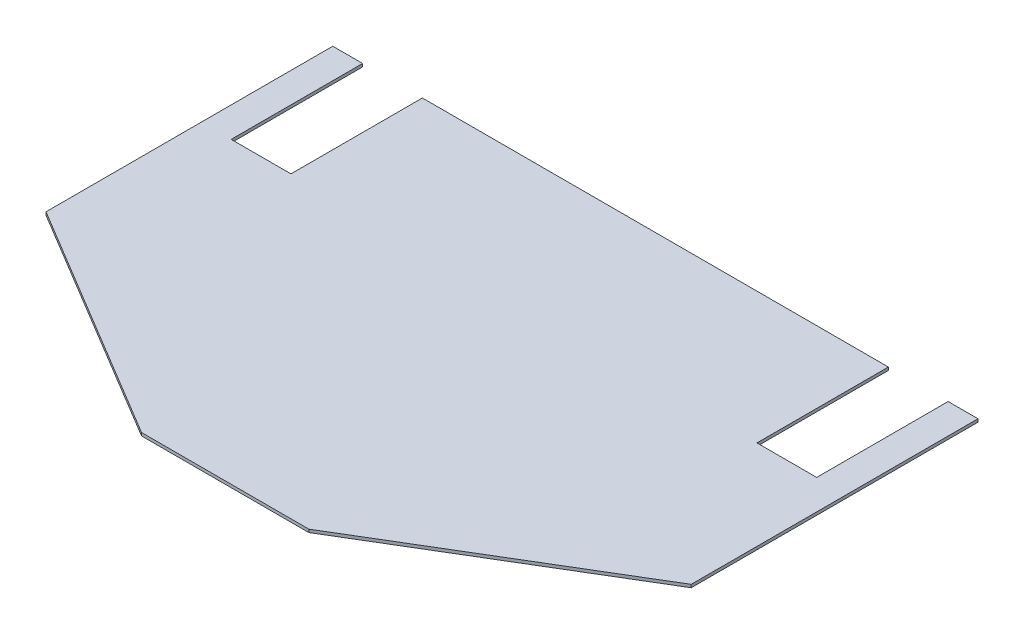
ISO-10303-21;
HEADER;
FILE_DESCRIPTION(('STEP AP214'),'2;1');
FILE_NAME('part.step','',(''),(''),'','','');
FILE_SCHEMA(('AUTOMOTIVE_DESIGN { 1 0 10303 214 1 1 1 1 }'));
ENDSEC;
DATA;
#1=APPLICATION_CONTEXT('core data for automotive mechanical design processes');
#2=APPLICATION_PROTOCOL_DEFINITION('international standard','automotive_design',2000,#1);
#3=PRODUCT_CONTEXT('',#1,'mechanical');
#4=PRODUCT('Part','Part','',(#3));
#5=PRODUCT_RELATED_PRODUCT_CATEGORY('part','',(#4));
#6=PRODUCT_DEFINITION_FORMATION('','',#4);
#7=PRODUCT_DEFINITION_CONTEXT('part definition',#1,'design');
#8=PRODUCT_DEFINITION('design','',#6,#7);
#9=PRODUCT_DEFINITION_SHAPE('','',#8);
#10=(LENGTH_UNIT() NAMED_UNIT(*) SI_UNIT(.MILLI.,.METRE.));
#11=(NAMED_UNIT(*) PLANE_ANGLE_UNIT() SI_UNIT($,.RADIAN.));
#12=(NAMED_UNIT(*) SI_UNIT($,.STERADIAN.) SOLID_ANGLE_UNIT());
#13=UNCERTAINTY_MEASURE_WITH_UNIT(LENGTH_MEASURE(1.E-05),#10,'distance_accuracy_value','');
#14=(GEOMETRIC_REPRESENTATION_CONTEXT(3) GLOBAL_UNCERTAINTY_ASSIGNED_CONTEXT((#13)) GLOBAL_UNIT_ASSIGNED_CONTEXT((#10,
#11,#12)) REPRESENTATION_CONTEXT('',''));
#15=CARTESIAN_POINT('',(0.,0.,0.));
#16=DIRECTION('',(0.,0.,1.));
#17=DIRECTION('',(1.,0.,0.));
#18=AXIS2_PLACEMENT_3D('',#15,#16,#17);
#19=CARTESIAN_POINT('',(0.,1.5875,0.));
#20=DIRECTION('',(0.,0.,-1.));
#21=DIRECTION('',(-1.,0.,0.));
#22=AXIS2_PLACEMENT_3D('',#19,#20,#21);
#23=PLANE('',#22);
#24=DIRECTION('',(1.,0.,0.));
#25=VECTOR('',#24,1.);
#26=CARTESIAN_POINT('',(0.,0.,0.));
#27=LINE('',#26,#25);
#28=CARTESIAN_POINT('',(-44.4499999999999,0.,0.));
#29=VERTEX_POINT('',#28);
#30=CARTESIAN_POINT('',(44.45,0.,0.));
#31=VERTEX_POINT('',#30);
#32=EDGE_CURVE('E170',#29,#31,#27,.T.);
#33=ORIENTED_EDGE('',*,*,#32,.T.);
#34=DIRECTION('',(0.,-1.,0.));
#35=VECTOR('',#34,1.);
#36=CARTESIAN_POINT('',(44.45,1.5875,0.));
#37=LINE('',#36,#35);
#38=CARTESIAN_POINT('',(44.45,1.5875,0.));
#39=VERTEX_POINT('',#38);
#40=EDGE_CURVE('E11',#39,#31,#37,.T.);
#41=ORIENTED_EDGE('',*,*,#40,.F.);
#42=DIRECTION('',(1.,0.,0.));
#43=VECTOR('',#42,1.);
#44=CARTESIAN_POINT('',(0.,1.5875,0.));
#45=LINE('',#44,#43);
#46=CARTESIAN_POINT('',(-44.4499999999999,1.5875,0.));
#47=VERTEX_POINT('',#46);
#48=EDGE_CURVE('E202',#47,#39,#45,.T.);
#49=ORIENTED_EDGE('',*,*,#48,.F.);
#50=DIRECTION('',(0.,-1.,0.));
#51=VECTOR('',#50,1.);
#52=CARTESIAN_POINT('',(-44.4499999999999,1.5875,0.));
#53=LINE('',#52,#51);
#54=EDGE_CURVE('E51',#47,#29,#53,.T.);
#55=ORIENTED_EDGE('',*,*,#54,.T.);
#56=EDGE_LOOP('',(#33,#41,#49,#55));
#57=FACE_BOUND('',#56,.T.);
#58=ADVANCED_FACE('F35',(#57),#23,.F.);
#59=CARTESIAN_POINT('',(11.7661764705882,1.5875,19.6102941176471));
#60=DIRECTION('',(-0.514495755427527,0.,-0.857492925712544));
#61=DIRECTION('',(-0.857492925712544,0.,0.514495755427527));
#62=AXIS2_PLACEMENT_3D('',#59,#60,#61);
#63=PLANE('',#62);
#64=DIRECTION('',(0.857492925712544,0.,-0.514495755427527));
#65=VECTOR('',#64,1.);
#66=CARTESIAN_POINT('',(11.7661764705882,0.,19.6102941176471));
#67=LINE('',#66,#65);
#68=CARTESIAN_POINT('',(171.45,0.,-76.2));
#69=VERTEX_POINT('',#68);
#70=EDGE_CURVE('E172',#31,#69,#67,.T.);
#71=ORIENTED_EDGE('',*,*,#70,.T.);
#72=DIRECTION('',(0.,-1.,0.));
#73=VECTOR('',#72,1.);
#74=CARTESIAN_POINT('',(171.45,1.5875,-76.2));
#75=LINE('',#74,#73);
#76=CARTESIAN_POINT('',(171.45,1.5875,-76.2));
#77=VERTEX_POINT('',#76);
#78=EDGE_CURVE('E43',#77,#69,#75,.T.);
#79=ORIENTED_EDGE('',*,*,#78,.F.);
#80=DIRECTION('',(0.857492925712544,0.,-0.514495755427527));
#81=VECTOR('',#80,1.);
#82=CARTESIAN_POINT('',(11.7661764705882,1.5875,19.6102941176471));
#83=LINE('',#82,#81);
#84=EDGE_CURVE('E107',#39,#77,#83,.T.);
#85=ORIENTED_EDGE('',*,*,#84,.F.);
#86=ORIENTED_EDGE('',*,*,#40,.T.);
#87=EDGE_LOOP('',(#71,#79,#85,#86));
#88=FACE_BOUND('',#87,.T.);
#89=ADVANCED_FACE('F276',(#88),#63,.F.);
#90=CARTESIAN_POINT('',(171.45,1.5875,0.));
#91=DIRECTION('',(-1.,0.,0.));
#92=DIRECTION('',(0.,0.,1.));
#93=AXIS2_PLACEMENT_3D('',#90,#91,#92);
#94=PLANE('',#93);
#95=DIRECTION('',(0.,0.,-1.));
#96=VECTOR('',#95,1.);
#97=CARTESIAN_POINT('',(171.45,0.,0.));
#98=LINE('',#97,#96);
#99=CARTESIAN_POINT('',(171.45,0.,-228.6));
#100=VERTEX_POINT('',#99);
#101=EDGE_CURVE('E174',#69,#100,#98,.T.);
#102=ORIENTED_EDGE('',*,*,#101,.T.);
#103=DIRECTION('',(0.,-1.,0.));
#104=VECTOR('',#103,1.);
#105=CARTESIAN_POINT('',(171.45,1.5875,-228.6));
#106=LINE('',#105,#104);
#107=CARTESIAN_POINT('',(171.45,1.5875,-228.6));
#108=VERTEX_POINT('',#107);
#109=EDGE_CURVE('E223',#108,#100,#106,.T.);
#110=ORIENTED_EDGE('',*,*,#109,.F.);
#111=DIRECTION('',(0.,0.,-1.));
#112=VECTOR('',#111,1.);
#113=CARTESIAN_POINT('',(171.45,1.5875,0.));
#114=LINE('',#113,#112);
#115=EDGE_CURVE('E231',#77,#108,#114,.T.);
#116=ORIENTED_EDGE('',*,*,#115,.F.);
#117=ORIENTED_EDGE('',*,*,#78,.T.);
#118=EDGE_LOOP('',(#102,#110,#116,#117));
#119=FACE_BOUND('',#118,.T.);
#120=ADVANCED_FACE('F229',(#119),#94,.F.);
#121=CARTESIAN_POINT('',(0.,1.5875,-228.6));
#122=DIRECTION('',(0.,0.,1.));
#123=DIRECTION('',(1.,0.,0.));
#124=AXIS2_PLACEMENT_3D('',#121,#122,#123);
#125=PLANE('',#124);
#126=DIRECTION('',(-1.,0.,0.));
#127=VECTOR('',#126,1.);
#128=CARTESIAN_POINT('',(0.,0.,-228.6));
#129=LINE('',#128,#127);
#130=CARTESIAN_POINT('',(155.575,0.,-228.6));
#131=VERTEX_POINT('',#130);
#132=EDGE_CURVE('E176',#100,#131,#129,.T.);
#133=ORIENTED_EDGE('',*,*,#132,.T.);
#134=DIRECTION('',(0.,-1.,0.));
#135=VECTOR('',#134,1.);
#136=CARTESIAN_POINT('',(155.575,1.5875,-228.6));
#137=LINE('',#136,#135);
#138=CARTESIAN_POINT('',(155.575,1.5875,-228.6));
#139=VERTEX_POINT('',#138);
#140=EDGE_CURVE('E220',#139,#131,#137,.T.);
#141=ORIENTED_EDGE('',*,*,#140,.F.);
#142=DIRECTION('',(-1.,0.,0.));
#143=VECTOR('',#142,1.);
#144=CARTESIAN_POINT('',(0.,1.5875,-228.6));
#145=LINE('',#144,#143);
#146=EDGE_CURVE('E248',#108,#139,#145,.T.);
#147=ORIENTED_EDGE('',*,*,#146,.F.);
#148=ORIENTED_EDGE('',*,*,#109,.T.);
#149=EDGE_LOOP('',(#133,#141,#147,#148));
#150=FACE_BOUND('',#149,.T.);
#151=ADVANCED_FACE('F239',(#150),#125,.F.);
#152=CARTESIAN_POINT('',(155.575,1.5875,0.));
#153=DIRECTION('',(1.,0.,0.));
#154=DIRECTION('',(0.,0.,-1.));
#155=AXIS2_PLACEMENT_3D('',#152,#153,#154);
#156=PLANE('',#155);
#157=DIRECTION('',(0.,0.,1.));
#158=VECTOR('',#157,1.);
#159=CARTESIAN_POINT('',(155.575,0.,0.));
#160=LINE('',#159,#158);
#161=CARTESIAN_POINT('',(155.575,0.,-158.75));
#162=VERTEX_POINT('',#161);
#163=EDGE_CURVE('E178',#131,#162,#160,.T.);
#164=ORIENTED_EDGE('',*,*,#163,.T.);
#165=DIRECTION('',(0.,-1.,0.));
#166=VECTOR('',#165,1.);
#167=CARTESIAN_POINT('',(155.575,1.5875,-158.75));
#168=LINE('',#167,#166);
#169=CARTESIAN_POINT('',(155.575,1.5875,-158.75));
#170=VERTEX_POINT('',#169);
#171=EDGE_CURVE('E217',#170,#162,#168,.T.);
#172=ORIENTED_EDGE('',*,*,#171,.F.);
#173=DIRECTION('',(0.,0.,1.));
#174=VECTOR('',#173,1.);
#175=CARTESIAN_POINT('',(155.575,1.5875,0.));
#176=LINE('',#175,#174);
#177=EDGE_CURVE('E245',#139,#170,#176,.T.);
#178=ORIENTED_EDGE('',*,*,#177,.F.);
#179=ORIENTED_EDGE('',*,*,#140,.T.);
#180=EDGE_LOOP('',(#164,#172,#178,#179));
#181=FACE_BOUND('',#180,.T.);
#182=ADVANCED_FACE('F243',(#181),#156,.F.);
#183=CARTESIAN_POINT('',(0.,1.5875,-158.75));
#184=DIRECTION('',(0.,0.,1.));
#185=DIRECTION('',(1.,0.,0.));
#186=AXIS2_PLACEMENT_3D('',#183,#184,#185);
#187=PLANE('',#186);
#188=DIRECTION('',(-1.,0.,0.));
#189=VECTOR('',#188,1.);
#190=CARTESIAN_POINT('',(0.,0.,-158.75));
#191=LINE('',#190,#189);
#192=CARTESIAN_POINT('',(123.825,0.,-158.75));
#193=VERTEX_POINT('',#192);
#194=EDGE_CURVE('E180',#162,#193,#191,.T.);
#195=ORIENTED_EDGE('',*,*,#194,.T.);
#196=DIRECTION('',(0.,-1.,0.));
#197=VECTOR('',#196,1.);
#198=CARTESIAN_POINT('',(123.825,1.5875,-158.75));
#199=LINE('',#198,#197);
#200=CARTESIAN_POINT('',(123.825,1.5875,-158.75));
#201=VERTEX_POINT('',#200);
#202=EDGE_CURVE('E215',#201,#193,#199,.T.);
#203=ORIENTED_EDGE('',*,*,#202,.F.);
#204=DIRECTION('',(-1.,0.,0.));
#205=VECTOR('',#204,1.);
#206=CARTESIAN_POINT('',(0.,1.5875,-158.75));
#207=LINE('',#206,#205);
#208=EDGE_CURVE('E247',#170,#201,#207,.T.);
#209=ORIENTED_EDGE('',*,*,#208,.F.);
#210=ORIENTED_EDGE('',*,*,#171,.T.);
#211=EDGE_LOOP('',(#195,#203,#209,#210));
#212=FACE_BOUND('',#211,.T.);
#213=ADVANCED_FACE('F292',(#212),#187,.F.);
#214=CARTESIAN_POINT('',(123.825,1.5875,0.));
#215=DIRECTION('',(1.,0.,0.));
#216=DIRECTION('',(0.,0.,-1.));
#217=AXIS2_PLACEMENT_3D('',#214,#215,#216);
#218=PLANE('',#217);
#219=DIRECTION('',(0.,0.,1.));
#220=VECTOR('',#219,1.);
#221=CARTESIAN_POINT('',(123.825,0.,0.));
#222=LINE('',#221,#220);
#223=CARTESIAN_POINT('',(123.825,0.,-228.6));
#224=VERTEX_POINT('',#223);
#225=EDGE_CURVE('E183',#224,#193,#222,.T.);
#226=ORIENTED_EDGE('',*,*,#225,.F.);
#227=DIRECTION('',(0.,-1.,0.));
#228=VECTOR('',#227,1.);
#229=CARTESIAN_POINT('',(123.825,1.5875,-228.6));
#230=LINE('',#229,#228);
#231=CARTESIAN_POINT('',(123.825,1.5875,-228.6));
#232=VERTEX_POINT('',#231);
#233=EDGE_CURVE('E213',#232,#224,#230,.T.);
#234=ORIENTED_EDGE('',*,*,#233,.F.);
#235=DIRECTION('',(0.,0.,1.));
#236=VECTOR('',#235,1.);
#237=CARTESIAN_POINT('',(123.825,1.5875,0.));
#238=LINE('',#237,#236);
#239=EDGE_CURVE('E250',#232,#201,#238,.T.);
#240=ORIENTED_EDGE('',*,*,#239,.T.);
#241=ORIENTED_EDGE('',*,*,#202,.T.);
#242=EDGE_LOOP('',(#226,#234,#240,#241));
#243=FACE_BOUND('',#242,.T.);
#244=ADVANCED_FACE('F295',(#243),#218,.T.);
#245=CARTESIAN_POINT('',(0.,1.5875,-228.6));
#246=DIRECTION('',(0.,0.,1.));
#247=DIRECTION('',(1.,0.,0.));
#248=AXIS2_PLACEMENT_3D('',#245,#246,#247);
#249=PLANE('',#248);
#250=DIRECTION('',(-1.,0.,0.));
#251=VECTOR('',#250,1.);
#252=CARTESIAN_POINT('',(0.,0.,-228.6));
#253=LINE('',#252,#251);
#254=CARTESIAN_POINT('',(-123.825,0.,-228.6));
#255=VERTEX_POINT('',#254);
#256=EDGE_CURVE('E186',#224,#255,#253,.T.);
#257=ORIENTED_EDGE('',*,*,#256,.T.);
#258=DIRECTION('',(0.,-1.,0.));
#259=VECTOR('',#258,1.);
#260=CARTESIAN_POINT('',(-123.825,1.5875,-228.6));
#261=LINE('',#260,#259);
#262=CARTESIAN_POINT('',(-123.825,1.5875,-228.6));
#263=VERTEX_POINT('',#262);
#264=EDGE_CURVE('E210',#263,#255,#261,.T.);
#265=ORIENTED_EDGE('',*,*,#264,.F.);
#266=DIRECTION('',(-1.,0.,0.));
#267=VECTOR('',#266,1.);
#268=CARTESIAN_POINT('',(0.,1.5875,-228.6));
#269=LINE('',#268,#267);
#270=EDGE_CURVE('E153',#232,#263,#269,.T.);
#271=ORIENTED_EDGE('',*,*,#270,.F.);
#272=ORIENTED_EDGE('',*,*,#233,.T.);
#273=EDGE_LOOP('',(#257,#265,#271,#272));
#274=FACE_BOUND('',#273,.T.);
#275=ADVANCED_FACE('F299',(#274),#249,.F.);
#276=CARTESIAN_POINT('',(-123.825,1.5875,0.));
#277=DIRECTION('',(1.,0.,0.));
#278=DIRECTION('',(0.,0.,-1.));
#279=AXIS2_PLACEMENT_3D('',#276,#277,#278);
#280=PLANE('',#279);
#281=DIRECTION('',(0.,0.,1.));
#282=VECTOR('',#281,1.);
#283=CARTESIAN_POINT('',(-123.825,0.,0.));
#284=LINE('',#283,#282);
#285=CARTESIAN_POINT('',(-123.825,0.,-158.75));
#286=VERTEX_POINT('',#285);
#287=EDGE_CURVE('E188',#255,#286,#284,.T.);
#288=ORIENTED_EDGE('',*,*,#287,.T.);
#289=DIRECTION('',(0.,-1.,0.));
#290=VECTOR('',#289,1.);
#291=CARTESIAN_POINT('',(-123.825,1.5875,-158.75));
#292=LINE('',#291,#290);
#293=CARTESIAN_POINT('',(-123.825,1.5875,-158.75));
#294=VERTEX_POINT('',#293);
#295=EDGE_CURVE('E208',#294,#286,#292,.T.);
#296=ORIENTED_EDGE('',*,*,#295,.F.);
#297=DIRECTION('',(0.,0.,1.));
#298=VECTOR('',#297,1.);
#299=CARTESIAN_POINT('',(-123.825,1.5875,0.));
#300=LINE('',#299,#298);
#301=EDGE_CURVE('E257',#263,#294,#300,.T.);
#302=ORIENTED_EDGE('',*,*,#301,.F.);
#303=ORIENTED_EDGE('',*,*,#264,.T.);
#304=EDGE_LOOP('',(#288,#296,#302,#303));
#305=FACE_BOUND('',#304,.T.);
#306=ADVANCED_FACE('F301',(#305),#280,.F.);
#307=CARTESIAN_POINT('',(0.,1.5875,-158.75));
#308=DIRECTION('',(0.,0.,-1.));
#309=DIRECTION('',(-1.,0.,0.));
#310=AXIS2_PLACEMENT_3D('',#307,#308,#309);
#311=PLANE('',#310);
#312=DIRECTION('',(1.,0.,0.));
#313=VECTOR('',#312,1.);
#314=CARTESIAN_POINT('',(0.,0.,-158.75));
#315=LINE('',#314,#313);
#316=CARTESIAN_POINT('',(-155.575,0.,-158.75));
#317=VERTEX_POINT('',#316);
#318=EDGE_CURVE('E191',#317,#286,#315,.T.);
#319=ORIENTED_EDGE('',*,*,#318,.F.);
#320=DIRECTION('',(0.,-1.,0.));
#321=VECTOR('',#320,1.);
#322=CARTESIAN_POINT('',(-155.575,1.5875,-158.75));
#323=LINE('',#322,#321);
#324=CARTESIAN_POINT('',(-155.575,1.5875,-158.75));
#325=VERTEX_POINT('',#324);
#326=EDGE_CURVE('E206',#325,#317,#323,.T.);
#327=ORIENTED_EDGE('',*,*,#326,.F.);
#328=DIRECTION('',(1.,0.,0.));
#329=VECTOR('',#328,1.);
#330=CARTESIAN_POINT('',(0.,1.5875,-158.75));
#331=LINE('',#330,#329);
#332=EDGE_CURVE('E258',#325,#294,#331,.T.);
#333=ORIENTED_EDGE('',*,*,#332,.T.);
#334=ORIENTED_EDGE('',*,*,#295,.T.);
#335=EDGE_LOOP('',(#319,#327,#333,#334));
#336=FACE_BOUND('',#335,.T.);
#337=ADVANCED_FACE('F304',(#336),#311,.T.);
#338=CARTESIAN_POINT('',(-155.575,1.5875,0.));
#339=DIRECTION('',(1.,0.,0.));
#340=DIRECTION('',(0.,0.,-1.));
#341=AXIS2_PLACEMENT_3D('',#338,#339,#340);
#342=PLANE('',#341);
#343=DIRECTION('',(0.,0.,1.));
#344=VECTOR('',#343,1.);
#345=CARTESIAN_POINT('',(-155.575,0.,0.));
#346=LINE('',#345,#344);
#347=CARTESIAN_POINT('',(-155.575,0.,-228.6));
#348=VERTEX_POINT('',#347);
#349=EDGE_CURVE('E194',#348,#317,#346,.T.);
#350=ORIENTED_EDGE('',*,*,#349,.F.);
#351=DIRECTION('',(0.,-1.,0.));
#352=VECTOR('',#351,1.);
#353=CARTESIAN_POINT('',(-155.575,1.5875,-228.6));
#354=LINE('',#353,#352);
#355=CARTESIAN_POINT('',(-155.575,1.5875,-228.6));
#356=VERTEX_POINT('',#355);
#357=EDGE_CURVE('E161',#356,#348,#354,.T.);
#358=ORIENTED_EDGE('',*,*,#357,.F.);
#359=DIRECTION('',(0.,0.,1.));
#360=VECTOR('',#359,1.);
#361=CARTESIAN_POINT('',(-155.575,1.5875,0.));
#362=LINE('',#361,#360);
#363=EDGE_CURVE('E150',#356,#325,#362,.T.);
#364=ORIENTED_EDGE('',*,*,#363,.T.);
#365=ORIENTED_EDGE('',*,*,#326,.T.);
#366=EDGE_LOOP('',(#350,#358,#364,#365));
#367=FACE_BOUND('',#366,.T.);
#368=ADVANCED_FACE('F263',(#367),#342,.T.);
#369=CARTESIAN_POINT('',(-171.45,0.,-228.6));
#370=VERTEX_POINT('',#369);
#371=EDGE_CURVE('E158',#348,#370,#253,.T.);
#372=ORIENTED_EDGE('',*,*,#371,.T.);
#373=DIRECTION('',(0.,-1.,0.));
#374=VECTOR('',#373,1.);
#375=CARTESIAN_POINT('',(-171.45,1.5875,-228.6));
#376=LINE('',#375,#374);
#377=CARTESIAN_POINT('',(-171.45,1.5875,-228.6));
#378=VERTEX_POINT('',#377);
#379=EDGE_CURVE('E155',#378,#370,#376,.T.);
#380=ORIENTED_EDGE('',*,*,#379,.F.);
#381=EDGE_CURVE('E142',#356,#378,#269,.T.);
#382=ORIENTED_EDGE('',*,*,#381,.F.);
#383=ORIENTED_EDGE('',*,*,#357,.T.);
#384=EDGE_LOOP('',(#372,#380,#382,#383));
#385=FACE_BOUND('',#384,.T.);
#386=ADVANCED_FACE('F156',(#385),#249,.F.);
#387=CARTESIAN_POINT('',(-171.45,1.5875,0.));
#388=DIRECTION('',(-1.,0.,0.));
#389=DIRECTION('',(0.,0.,1.));
#390=AXIS2_PLACEMENT_3D('',#387,#388,#389);
#391=PLANE('',#390);
#392=DIRECTION('',(0.,0.,-1.));
#393=VECTOR('',#392,1.);
#394=CARTESIAN_POINT('',(-171.45,0.,0.));
#395=LINE('',#394,#393);
#396=CARTESIAN_POINT('',(-171.45,0.,-76.2));
#397=VERTEX_POINT('',#396);
#398=EDGE_CURVE('E197',#397,#370,#395,.T.);
#399=ORIENTED_EDGE('',*,*,#398,.F.);
#400=DIRECTION('',(0.,-1.,0.));
#401=VECTOR('',#400,1.);
#402=CARTESIAN_POINT('',(-171.45,1.5875,-76.2));
#403=LINE('',#402,#401);
#404=CARTESIAN_POINT('',(-171.45,1.5875,-76.2));
#405=VERTEX_POINT('',#404);
#406=EDGE_CURVE('E95',#405,#397,#403,.T.);
#407=ORIENTED_EDGE('',*,*,#406,.F.);
#408=DIRECTION('',(0.,0.,-1.));
#409=VECTOR('',#408,1.);
#410=CARTESIAN_POINT('',(-171.45,1.5875,0.));
#411=LINE('',#410,#409);
#412=EDGE_CURVE('E147',#405,#378,#411,.T.);
#413=ORIENTED_EDGE('',*,*,#412,.T.);
#414=ORIENTED_EDGE('',*,*,#379,.T.);
#415=EDGE_LOOP('',(#399,#407,#413,#414));
#416=FACE_BOUND('',#415,.T.);
#417=ADVANCED_FACE('F163',(#416),#391,.T.);
#418=CARTESIAN_POINT('',(-11.7661764705882,1.5875,19.610294117647));
#419=DIRECTION('',(-0.514495755427526,0.,0.857492925712544));
#420=DIRECTION('',(0.857492925712544,0.,0.514495755427526));
#421=AXIS2_PLACEMENT_3D('',#418,#419,#420);
#422=PLANE('',#421);
#423=DIRECTION('',(-0.857492925712544,0.,-0.514495755427526));
#424=VECTOR('',#423,1.);
#425=CARTESIAN_POINT('',(-11.7661764705882,0.,19.610294117647));
#426=LINE('',#425,#424);
#427=EDGE_CURVE('E199',#29,#397,#426,.T.);
#428=ORIENTED_EDGE('',*,*,#427,.F.);
#429=ORIENTED_EDGE('',*,*,#54,.F.);
#430=DIRECTION('',(-0.857492925712544,0.,-0.514495755427526));
#431=VECTOR('',#430,1.);
#432=CARTESIAN_POINT('',(-11.7661764705882,1.5875,19.610294117647));
#433=LINE('',#432,#431);
#434=EDGE_CURVE('E164',#47,#405,#433,.T.);
#435=ORIENTED_EDGE('',*,*,#434,.T.);
#436=ORIENTED_EDGE('',*,*,#406,.T.);
#437=EDGE_LOOP('',(#428,#429,#435,#436));
#438=FACE_BOUND('',#437,.T.);
#439=ADVANCED_FACE('F265',(#438),#422,.T.);
#440=CARTESIAN_POINT('',(0.,1.5875,0.));
#441=DIRECTION('',(0.,1.,0.));
#442=DIRECTION('',(0.,0.,1.));
#443=AXIS2_PLACEMENT_3D('',#440,#441,#442);
#444=PLANE('',#443);
#445=ORIENTED_EDGE('',*,*,#48,.T.);
#446=ORIENTED_EDGE('',*,*,#84,.T.);
#447=ORIENTED_EDGE('',*,*,#115,.T.);
#448=ORIENTED_EDGE('',*,*,#146,.T.);
#449=ORIENTED_EDGE('',*,*,#177,.T.);
#450=ORIENTED_EDGE('',*,*,#208,.T.);
#451=ORIENTED_EDGE('',*,*,#239,.F.);
#452=ORIENTED_EDGE('',*,*,#270,.T.);
#453=ORIENTED_EDGE('',*,*,#301,.T.);
#454=ORIENTED_EDGE('',*,*,#332,.F.);
#455=ORIENTED_EDGE('',*,*,#363,.F.);
#456=ORIENTED_EDGE('',*,*,#381,.T.);
#457=ORIENTED_EDGE('',*,*,#412,.F.);
#458=ORIENTED_EDGE('',*,*,#434,.F.);
#459=EDGE_LOOP('',(#445,#446,#447,#448,#449,#450,#451,#452,#453,#454,#455,#456,#457,#458));
#460=FACE_BOUND('',#459,.T.);
#461=ADVANCED_FACE('F144',(#460),#444,.T.);
#462=CARTESIAN_POINT('',(0.,0.,0.));
#463=DIRECTION('',(0.,1.,0.));
#464=DIRECTION('',(0.,0.,1.));
#465=AXIS2_PLACEMENT_3D('',#462,#463,#464);
#466=PLANE('',#465);
#467=ORIENTED_EDGE('',*,*,#32,.F.);
#468=ORIENTED_EDGE('',*,*,#427,.T.);
#469=ORIENTED_EDGE('',*,*,#398,.T.);
#470=ORIENTED_EDGE('',*,*,#371,.F.);
#471=ORIENTED_EDGE('',*,*,#349,.T.);
#472=ORIENTED_EDGE('',*,*,#318,.T.);
#473=ORIENTED_EDGE('',*,*,#287,.F.);
#474=ORIENTED_EDGE('',*,*,#256,.F.);
#475=ORIENTED_EDGE('',*,*,#225,.T.);
#476=ORIENTED_EDGE('',*,*,#194,.F.);
#477=ORIENTED_EDGE('',*,*,#163,.F.);
#478=ORIENTED_EDGE('',*,*,#132,.F.);
#479=ORIENTED_EDGE('',*,*,#101,.F.);
#480=ORIENTED_EDGE('',*,*,#70,.F.);
#481=EDGE_LOOP('',(#467,#468,#469,#470,#471,#472,#473,#474,#475,#476,#477,#478,#479,#480));
#482=FACE_BOUND('',#481,.T.);
#483=ADVANCED_FACE('F234',(#482),#466,.F.);
#484=CLOSED_SHELL('',(#58,#89,#120,#151,#182,#213,#244,#275,#306,#337,#368,#386,#417,#439,#461,#483));
#485=MANIFOLD_SOLID_BREP('B2',#484);
#486=ADVANCED_BREP_SHAPE_REPRESENTATION('',(#18,#485),#14);
#487=SHAPE_DEFINITION_REPRESENTATION(#9,#486);
ENDSEC;
END-ISO-10303-21;
